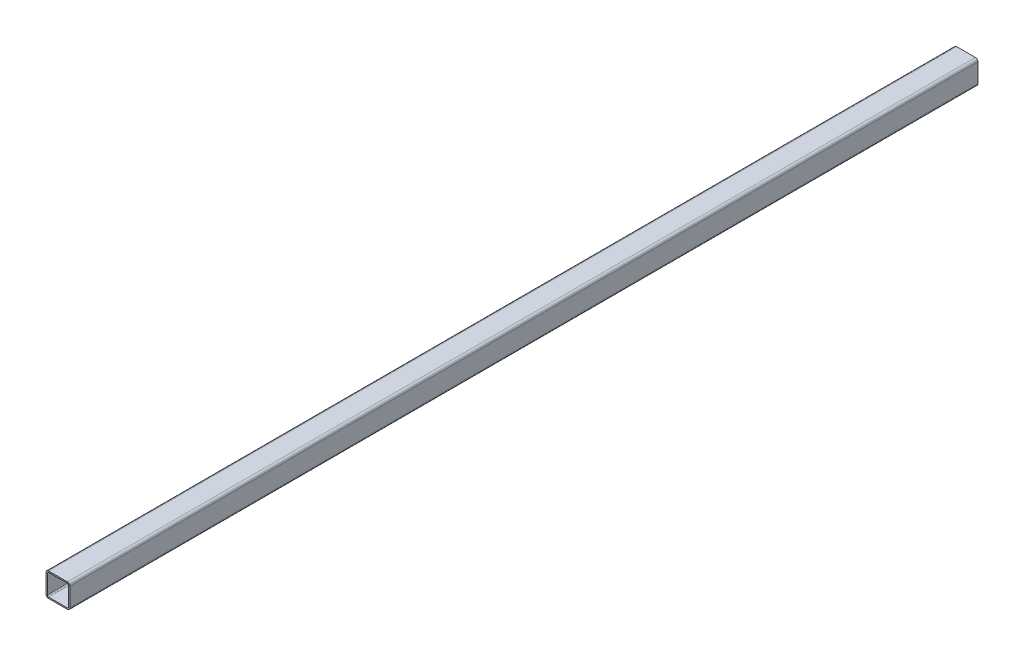
ISO-10303-21;
HEADER;
FILE_DESCRIPTION(('STEP AP214'),'2;1');
FILE_NAME('part.step','',(''),(''),'','','');
FILE_SCHEMA(('AUTOMOTIVE_DESIGN { 1 0 10303 214 1 1 1 1 }'));
ENDSEC;
DATA;
#1=APPLICATION_CONTEXT('core data for automotive mechanical design processes');
#2=APPLICATION_PROTOCOL_DEFINITION('international standard','automotive_design',2000,#1);
#3=PRODUCT_CONTEXT('',#1,'mechanical');
#4=PRODUCT('Part','Part','',(#3));
#5=PRODUCT_RELATED_PRODUCT_CATEGORY('part','',(#4));
#6=PRODUCT_DEFINITION_FORMATION('','',#4);
#7=PRODUCT_DEFINITION_CONTEXT('part definition',#1,'design');
#8=PRODUCT_DEFINITION('design','',#6,#7);
#9=PRODUCT_DEFINITION_SHAPE('','',#8);
#10=(LENGTH_UNIT() NAMED_UNIT(*) SI_UNIT(.MILLI.,.METRE.));
#11=(NAMED_UNIT(*) PLANE_ANGLE_UNIT() SI_UNIT($,.RADIAN.));
#12=(NAMED_UNIT(*) SI_UNIT($,.STERADIAN.) SOLID_ANGLE_UNIT());
#13=UNCERTAINTY_MEASURE_WITH_UNIT(LENGTH_MEASURE(1.E-05),#10,'distance_accuracy_value','');
#14=(GEOMETRIC_REPRESENTATION_CONTEXT(3) GLOBAL_UNCERTAINTY_ASSIGNED_CONTEXT((#13)) GLOBAL_UNIT_ASSIGNED_CONTEXT((#10,
#11,#12)) REPRESENTATION_CONTEXT('',''));
#15=CARTESIAN_POINT('',(0.,0.,0.));
#16=DIRECTION('',(0.,0.,1.));
#17=DIRECTION('',(1.,0.,0.));
#18=AXIS2_PLACEMENT_3D('',#15,#16,#17);
#19=CARTESIAN_POINT('',(660.,260.,-950.));
#20=DIRECTION('',(0.,-1.,0.));
#21=DIRECTION('',(0.,0.,-1.));
#22=AXIS2_PLACEMENT_3D('',#19,#20,#21);
#23=CYLINDRICAL_SURFACE('',#22,2.49999999999995);
#24=CARTESIAN_POINT('',(660.,270.,-950.));
#25=DIRECTION('',(0.,-1.,0.));
#26=DIRECTION('',(0.,0.,-1.));
#27=AXIS2_PLACEMENT_3D('',#24,#25,#26);
#28=CIRCLE('',#27,2.49999999999995);
#29=CARTESIAN_POINT('',(660.,270.,-952.5));
#30=VERTEX_POINT('',#29);
#31=EDGE_CURVE('E183',#30,#30,#28,.T.);
#32=ORIENTED_EDGE('',*,*,#31,.T.);
#33=EDGE_LOOP('',(#32));
#34=FACE_BOUND('',#33,.T.);
#35=CARTESIAN_POINT('',(660.,273.2,-950.));
#36=DIRECTION('',(0.,-1.,0.));
#37=DIRECTION('',(0.,0.,-1.));
#38=AXIS2_PLACEMENT_3D('',#35,#36,#37);
#39=CIRCLE('',#38,2.49999999999995);
#40=CARTESIAN_POINT('',(660.,273.2,-952.5));
#41=VERTEX_POINT('',#40);
#42=EDGE_CURVE('E20',#41,#41,#39,.T.);
#43=ORIENTED_EDGE('',*,*,#42,.F.);
#44=EDGE_LOOP('',(#43));
#45=FACE_BOUND('',#44,.T.);
#46=ADVANCED_FACE('F17',(#34,#45),#23,.F.);
#47=CARTESIAN_POINT('',(660.,260.,-910.));
#48=DIRECTION('',(0.,-1.,0.));
#49=DIRECTION('',(0.,0.,-1.));
#50=AXIS2_PLACEMENT_3D('',#47,#48,#49);
#51=CYLINDRICAL_SURFACE('',#50,2.49999999999995);
#52=CARTESIAN_POINT('',(660.,270.,-910.));
#53=DIRECTION('',(0.,-1.,0.));
#54=DIRECTION('',(0.,0.,-1.));
#55=AXIS2_PLACEMENT_3D('',#52,#53,#54);
#56=CIRCLE('',#55,2.49999999999995);
#57=CARTESIAN_POINT('',(660.,270.,-912.5));
#58=VERTEX_POINT('',#57);
#59=EDGE_CURVE('E253',#58,#58,#56,.T.);
#60=ORIENTED_EDGE('',*,*,#59,.T.);
#61=EDGE_LOOP('',(#60));
#62=FACE_BOUND('',#61,.T.);
#63=CARTESIAN_POINT('',(660.,273.2,-910.));
#64=DIRECTION('',(0.,-1.,0.));
#65=DIRECTION('',(0.,0.,-1.));
#66=AXIS2_PLACEMENT_3D('',#63,#64,#65);
#67=CIRCLE('',#66,2.49999999999995);
#68=CARTESIAN_POINT('',(660.,273.2,-912.5));
#69=VERTEX_POINT('',#68);
#70=EDGE_CURVE('E274',#69,#69,#67,.T.);
#71=ORIENTED_EDGE('',*,*,#70,.F.);
#72=EDGE_LOOP('',(#71));
#73=FACE_BOUND('',#72,.T.);
#74=ADVANCED_FACE('F284',(#62,#73),#51,.F.);
#75=CARTESIAN_POINT('',(680.,260.,-910.));
#76=DIRECTION('',(0.,-1.,0.));
#77=DIRECTION('',(0.,0.,-1.));
#78=AXIS2_PLACEMENT_3D('',#75,#76,#77);
#79=CYLINDRICAL_SURFACE('',#78,2.49999999999995);
#80=CARTESIAN_POINT('',(680.,270.,-910.));
#81=DIRECTION('',(0.,-1.,0.));
#82=DIRECTION('',(0.,0.,-1.));
#83=AXIS2_PLACEMENT_3D('',#80,#81,#82);
#84=CIRCLE('',#83,2.49999999999995);
#85=CARTESIAN_POINT('',(680.,270.,-912.5));
#86=VERTEX_POINT('',#85);
#87=EDGE_CURVE('E250',#86,#86,#84,.T.);
#88=ORIENTED_EDGE('',*,*,#87,.T.);
#89=EDGE_LOOP('',(#88));
#90=FACE_BOUND('',#89,.T.);
#91=CARTESIAN_POINT('',(680.,273.2,-910.));
#92=DIRECTION('',(0.,-1.,0.));
#93=DIRECTION('',(0.,0.,-1.));
#94=AXIS2_PLACEMENT_3D('',#91,#92,#93);
#95=CIRCLE('',#94,2.49999999999995);
#96=CARTESIAN_POINT('',(680.,273.2,-912.5));
#97=VERTEX_POINT('',#96);
#98=EDGE_CURVE('E272',#97,#97,#95,.T.);
#99=ORIENTED_EDGE('',*,*,#98,.F.);
#100=EDGE_LOOP('',(#99));
#101=FACE_BOUND('',#100,.T.);
#102=ADVANCED_FACE('F290',(#90,#101),#79,.F.);
#103=CARTESIAN_POINT('',(680.,260.,-950.));
#104=DIRECTION('',(0.,-1.,0.));
#105=DIRECTION('',(0.,0.,-1.));
#106=AXIS2_PLACEMENT_3D('',#103,#104,#105);
#107=CYLINDRICAL_SURFACE('',#106,2.49999999999995);
#108=CARTESIAN_POINT('',(680.,270.,-950.));
#109=DIRECTION('',(0.,-1.,0.));
#110=DIRECTION('',(0.,0.,-1.));
#111=AXIS2_PLACEMENT_3D('',#108,#109,#110);
#112=CIRCLE('',#111,2.49999999999995);
#113=CARTESIAN_POINT('',(680.,270.,-952.5));
#114=VERTEX_POINT('',#113);
#115=EDGE_CURVE('E247',#114,#114,#112,.T.);
#116=ORIENTED_EDGE('',*,*,#115,.T.);
#117=EDGE_LOOP('',(#116));
#118=FACE_BOUND('',#117,.T.);
#119=CARTESIAN_POINT('',(680.,273.2,-950.));
#120=DIRECTION('',(0.,-1.,0.));
#121=DIRECTION('',(0.,0.,-1.));
#122=AXIS2_PLACEMENT_3D('',#119,#120,#121);
#123=CIRCLE('',#122,2.49999999999995);
#124=CARTESIAN_POINT('',(680.,273.2,-952.5));
#125=VERTEX_POINT('',#124);
#126=EDGE_CURVE('E269',#125,#125,#123,.T.);
#127=ORIENTED_EDGE('',*,*,#126,.F.);
#128=EDGE_LOOP('',(#127));
#129=FACE_BOUND('',#128,.T.);
#130=ADVANCED_FACE('F375',(#118,#129),#107,.F.);
#131=CARTESIAN_POINT('',(680.,260.,950.));
#132=DIRECTION('',(0.,-1.,0.));
#133=DIRECTION('',(0.,0.,-1.));
#134=AXIS2_PLACEMENT_3D('',#131,#132,#133);
#135=CYLINDRICAL_SURFACE('',#134,2.49999999999995);
#136=CARTESIAN_POINT('',(680.,270.,950.));
#137=DIRECTION('',(0.,-1.,0.));
#138=DIRECTION('',(0.,0.,-1.));
#139=AXIS2_PLACEMENT_3D('',#136,#137,#138);
#140=CIRCLE('',#139,2.49999999999995);
#141=CARTESIAN_POINT('',(680.,270.,947.5));
#142=VERTEX_POINT('',#141);
#143=EDGE_CURVE('E244',#142,#142,#140,.T.);
#144=ORIENTED_EDGE('',*,*,#143,.T.);
#145=EDGE_LOOP('',(#144));
#146=FACE_BOUND('',#145,.T.);
#147=CARTESIAN_POINT('',(680.,273.2,950.));
#148=DIRECTION('',(0.,-1.,0.));
#149=DIRECTION('',(0.,0.,-1.));
#150=AXIS2_PLACEMENT_3D('',#147,#148,#149);
#151=CIRCLE('',#150,2.49999999999995);
#152=CARTESIAN_POINT('',(680.,273.2,947.5));
#153=VERTEX_POINT('',#152);
#154=EDGE_CURVE('E266',#153,#153,#151,.T.);
#155=ORIENTED_EDGE('',*,*,#154,.F.);
#156=EDGE_LOOP('',(#155));
#157=FACE_BOUND('',#156,.T.);
#158=ADVANCED_FACE('F371',(#146,#157),#135,.F.);
#159=CARTESIAN_POINT('',(680.,260.,910.));
#160=DIRECTION('',(0.,-1.,0.));
#161=DIRECTION('',(0.,0.,-1.));
#162=AXIS2_PLACEMENT_3D('',#159,#160,#161);
#163=CYLINDRICAL_SURFACE('',#162,2.49999999999995);
#164=CARTESIAN_POINT('',(680.,270.,910.));
#165=DIRECTION('',(0.,-1.,0.));
#166=DIRECTION('',(0.,0.,-1.));
#167=AXIS2_PLACEMENT_3D('',#164,#165,#166);
#168=CIRCLE('',#167,2.49999999999995);
#169=CARTESIAN_POINT('',(680.,270.,907.5));
#170=VERTEX_POINT('',#169);
#171=EDGE_CURVE('E241',#170,#170,#168,.T.);
#172=ORIENTED_EDGE('',*,*,#171,.T.);
#173=EDGE_LOOP('',(#172));
#174=FACE_BOUND('',#173,.T.);
#175=CARTESIAN_POINT('',(680.,273.2,910.));
#176=DIRECTION('',(0.,-1.,0.));
#177=DIRECTION('',(0.,0.,-1.));
#178=AXIS2_PLACEMENT_3D('',#175,#176,#177);
#179=CIRCLE('',#178,2.49999999999995);
#180=CARTESIAN_POINT('',(680.,273.2,907.5));
#181=VERTEX_POINT('',#180);
#182=EDGE_CURVE('E263',#181,#181,#179,.T.);
#183=ORIENTED_EDGE('',*,*,#182,.F.);
#184=EDGE_LOOP('',(#183));
#185=FACE_BOUND('',#184,.T.);
#186=ADVANCED_FACE('F367',(#174,#185),#163,.F.);
#187=CARTESIAN_POINT('',(660.,260.,910.));
#188=DIRECTION('',(0.,-1.,0.));
#189=DIRECTION('',(0.,0.,-1.));
#190=AXIS2_PLACEMENT_3D('',#187,#188,#189);
#191=CYLINDRICAL_SURFACE('',#190,2.49999999999995);
#192=CARTESIAN_POINT('',(660.,270.,910.));
#193=DIRECTION('',(0.,-1.,0.));
#194=DIRECTION('',(0.,0.,-1.));
#195=AXIS2_PLACEMENT_3D('',#192,#193,#194);
#196=CIRCLE('',#195,2.49999999999995);
#197=CARTESIAN_POINT('',(660.,270.,907.5));
#198=VERTEX_POINT('',#197);
#199=EDGE_CURVE('E238',#198,#198,#196,.T.);
#200=ORIENTED_EDGE('',*,*,#199,.T.);
#201=EDGE_LOOP('',(#200));
#202=FACE_BOUND('',#201,.T.);
#203=CARTESIAN_POINT('',(660.,273.2,910.));
#204=DIRECTION('',(0.,-1.,0.));
#205=DIRECTION('',(0.,0.,-1.));
#206=AXIS2_PLACEMENT_3D('',#203,#204,#205);
#207=CIRCLE('',#206,2.49999999999995);
#208=CARTESIAN_POINT('',(660.,273.2,907.5));
#209=VERTEX_POINT('',#208);
#210=EDGE_CURVE('E260',#209,#209,#207,.T.);
#211=ORIENTED_EDGE('',*,*,#210,.F.);
#212=EDGE_LOOP('',(#211));
#213=FACE_BOUND('',#212,.T.);
#214=ADVANCED_FACE('F363',(#202,#213),#191,.F.);
#215=CARTESIAN_POINT('',(660.,260.,950.));
#216=DIRECTION('',(0.,-1.,0.));
#217=DIRECTION('',(0.,0.,-1.));
#218=AXIS2_PLACEMENT_3D('',#215,#216,#217);
#219=CYLINDRICAL_SURFACE('',#218,2.49999999999995);
#220=CARTESIAN_POINT('',(660.,270.,950.));
#221=DIRECTION('',(0.,-1.,0.));
#222=DIRECTION('',(0.,0.,-1.));
#223=AXIS2_PLACEMENT_3D('',#220,#221,#222);
#224=CIRCLE('',#223,2.49999999999995);
#225=CARTESIAN_POINT('',(660.,270.,947.5));
#226=VERTEX_POINT('',#225);
#227=EDGE_CURVE('E179',#226,#226,#224,.T.);
#228=ORIENTED_EDGE('',*,*,#227,.T.);
#229=EDGE_LOOP('',(#228));
#230=FACE_BOUND('',#229,.T.);
#231=CARTESIAN_POINT('',(660.,273.2,950.));
#232=DIRECTION('',(0.,-1.,0.));
#233=DIRECTION('',(0.,0.,-1.));
#234=AXIS2_PLACEMENT_3D('',#231,#232,#233);
#235=CIRCLE('',#234,2.49999999999995);
#236=CARTESIAN_POINT('',(660.,273.2,947.5));
#237=VERTEX_POINT('',#236);
#238=EDGE_CURVE('E196',#237,#237,#235,.T.);
#239=ORIENTED_EDGE('',*,*,#238,.F.);
#240=EDGE_LOOP('',(#239));
#241=FACE_BOUND('',#240,.T.);
#242=ADVANCED_FACE('F359',(#230,#241),#219,.F.);
#243=CARTESIAN_POINT('',(646.4,276.4,1170.));
#244=DIRECTION('',(0.,0.,-1.));
#245=DIRECTION('',(-1.,0.,0.));
#246=AXIS2_PLACEMENT_3D('',#243,#244,#245);
#247=CYLINDRICAL_SURFACE('',#246,3.19999999999998);
#248=CARTESIAN_POINT('',(646.4,276.4,-1140.));
#249=DIRECTION('',(0.,0.,-1.));
#250=DIRECTION('',(-1.,0.,0.));
#251=AXIS2_PLACEMENT_3D('',#248,#249,#250);
#252=CIRCLE('',#251,3.19999999999998);
#253=CARTESIAN_POINT('',(643.2,276.4,-1140.));
#254=VERTEX_POINT('',#253);
#255=CARTESIAN_POINT('',(646.4,273.2,-1140.));
#256=VERTEX_POINT('',#255);
#257=EDGE_CURVE('E218',#254,#256,#252,.F.);
#258=ORIENTED_EDGE('',*,*,#257,.F.);
#259=DIRECTION('',(0.,0.,1.));
#260=VECTOR('',#259,1.);
#261=CARTESIAN_POINT('',(643.2,276.4,1170.));
#262=LINE('',#261,#260);
#263=CARTESIAN_POINT('',(643.2,276.4,1140.));
#264=VERTEX_POINT('',#263);
#265=EDGE_CURVE('E184',#264,#254,#262,.F.);
#266=ORIENTED_EDGE('',*,*,#265,.F.);
#267=CARTESIAN_POINT('',(646.4,276.4,1140.));
#268=DIRECTION('',(0.,0.,-1.));
#269=DIRECTION('',(-1.,0.,0.));
#270=AXIS2_PLACEMENT_3D('',#267,#268,#269);
#271=CIRCLE('',#270,3.19999999999998);
#272=CARTESIAN_POINT('',(646.4,273.2,1140.));
#273=VERTEX_POINT('',#272);
#274=EDGE_CURVE('E234',#273,#264,#271,.T.);
#275=ORIENTED_EDGE('',*,*,#274,.F.);
#276=DIRECTION('',(0.,0.,1.));
#277=VECTOR('',#276,1.);
#278=CARTESIAN_POINT('',(646.4,273.2,1170.));
#279=LINE('',#278,#277);
#280=EDGE_CURVE('E194',#256,#273,#279,.T.);
#281=ORIENTED_EDGE('',*,*,#280,.F.);
#282=EDGE_LOOP('',(#258,#266,#275,#281));
#283=FACE_BOUND('',#282,.T.);
#284=ADVANCED_FACE('F355',(#283),#247,.F.);
#285=CARTESIAN_POINT('',(646.4,273.2,1170.));
#286=DIRECTION('',(0.,1.,0.));
#287=DIRECTION('',(-1.,0.,0.));
#288=AXIS2_PLACEMENT_3D('',#285,#286,#287);
#289=PLANE('',#288);
#290=ORIENTED_EDGE('',*,*,#280,.T.);
#291=DIRECTION('',(1.,0.,0.));
#292=VECTOR('',#291,1.);
#293=CARTESIAN_POINT('',(693.6,273.2,1140.));
#294=LINE('',#293,#292);
#295=CARTESIAN_POINT('',(693.6,273.2,1140.));
#296=VERTEX_POINT('',#295);
#297=EDGE_CURVE('E158',#296,#273,#294,.F.);
#298=ORIENTED_EDGE('',*,*,#297,.F.);
#299=DIRECTION('',(0.,0.,-1.));
#300=VECTOR('',#299,1.);
#301=CARTESIAN_POINT('',(693.6,273.2,1170.));
#302=LINE('',#301,#300);
#303=CARTESIAN_POINT('',(693.6,273.2,-1140.));
#304=VERTEX_POINT('',#303);
#305=EDGE_CURVE('E191',#296,#304,#302,.T.);
#306=ORIENTED_EDGE('',*,*,#305,.T.);
#307=DIRECTION('',(-1.,0.,0.));
#308=VECTOR('',#307,1.);
#309=CARTESIAN_POINT('',(646.4,273.2,-1140.));
#310=LINE('',#309,#308);
#311=EDGE_CURVE('E217',#256,#304,#310,.F.);
#312=ORIENTED_EDGE('',*,*,#311,.F.);
#313=EDGE_LOOP('',(#290,#298,#306,#312));
#314=FACE_BOUND('',#313,.T.);
#315=ORIENTED_EDGE('',*,*,#238,.T.);
#316=EDGE_LOOP('',(#315));
#317=FACE_BOUND('',#316,.T.);
#318=ORIENTED_EDGE('',*,*,#210,.T.);
#319=EDGE_LOOP('',(#318));
#320=FACE_BOUND('',#319,.T.);
#321=ORIENTED_EDGE('',*,*,#182,.T.);
#322=EDGE_LOOP('',(#321));
#323=FACE_BOUND('',#322,.T.);
#324=ORIENTED_EDGE('',*,*,#154,.T.);
#325=EDGE_LOOP('',(#324));
#326=FACE_BOUND('',#325,.T.);
#327=ORIENTED_EDGE('',*,*,#126,.T.);
#328=EDGE_LOOP('',(#327));
#329=FACE_BOUND('',#328,.T.);
#330=ORIENTED_EDGE('',*,*,#98,.T.);
#331=EDGE_LOOP('',(#330));
#332=FACE_BOUND('',#331,.T.);
#333=ORIENTED_EDGE('',*,*,#70,.T.);
#334=EDGE_LOOP('',(#333));
#335=FACE_BOUND('',#334,.T.);
#336=ORIENTED_EDGE('',*,*,#42,.T.);
#337=EDGE_LOOP('',(#336));
#338=FACE_BOUND('',#337,.T.);
#339=ADVANCED_FACE('F281',(#314,#317,#320,#323,#326,#329,#332,#335,#338),#289,.T.);
#340=CARTESIAN_POINT('',(693.6,276.4,1170.));
#341=DIRECTION('',(0.,0.,-1.));
#342=DIRECTION('',(-1.,0.,0.));
#343=AXIS2_PLACEMENT_3D('',#340,#341,#342);
#344=CYLINDRICAL_SURFACE('',#343,3.19999999999998);
#345=CARTESIAN_POINT('',(693.6,276.4,-1140.));
#346=DIRECTION('',(0.,0.,-1.));
#347=DIRECTION('',(-1.,0.,0.));
#348=AXIS2_PLACEMENT_3D('',#345,#346,#347);
#349=CIRCLE('',#348,3.19999999999998);
#350=CARTESIAN_POINT('',(696.8,276.4,-1140.));
#351=VERTEX_POINT('',#350);
#352=EDGE_CURVE('E215',#304,#351,#349,.F.);
#353=ORIENTED_EDGE('',*,*,#352,.F.);
#354=ORIENTED_EDGE('',*,*,#305,.F.);
#355=CARTESIAN_POINT('',(693.6,276.4,1140.));
#356=DIRECTION('',(0.,0.,-1.));
#357=DIRECTION('',(-1.,0.,0.));
#358=AXIS2_PLACEMENT_3D('',#355,#356,#357);
#359=CIRCLE('',#358,3.19999999999998);
#360=CARTESIAN_POINT('',(696.8,276.4,1140.));
#361=VERTEX_POINT('',#360);
#362=EDGE_CURVE('E156',#361,#296,#359,.T.);
#363=ORIENTED_EDGE('',*,*,#362,.F.);
#364=DIRECTION('',(0.,0.,1.));
#365=VECTOR('',#364,1.);
#366=CARTESIAN_POINT('',(696.8,276.4,1170.));
#367=LINE('',#366,#365);
#368=EDGE_CURVE('E142',#351,#361,#367,.T.);
#369=ORIENTED_EDGE('',*,*,#368,.F.);
#370=EDGE_LOOP('',(#353,#354,#363,#369));
#371=FACE_BOUND('',#370,.T.);
#372=ADVANCED_FACE('F349',(#371),#344,.F.);
#373=CARTESIAN_POINT('',(696.8,323.6,1170.));
#374=DIRECTION('',(-1.,0.,0.));
#375=DIRECTION('',(0.,0.,1.));
#376=AXIS2_PLACEMENT_3D('',#373,#374,#375);
#377=PLANE('',#376);
#378=ORIENTED_EDGE('',*,*,#368,.T.);
#379=DIRECTION('',(0.,1.,0.));
#380=VECTOR('',#379,1.);
#381=CARTESIAN_POINT('',(696.8,300.,1140.));
#382=LINE('',#381,#380);
#383=CARTESIAN_POINT('',(696.8,323.6,1140.));
#384=VERTEX_POINT('',#383);
#385=EDGE_CURVE('E149',#384,#361,#382,.F.);
#386=ORIENTED_EDGE('',*,*,#385,.F.);
#387=DIRECTION('',(0.,0.,-1.));
#388=VECTOR('',#387,1.);
#389=CARTESIAN_POINT('',(696.8,323.6,1170.));
#390=LINE('',#389,#388);
#391=CARTESIAN_POINT('',(696.8,323.6,-1140.));
#392=VERTEX_POINT('',#391);
#393=EDGE_CURVE('E134',#384,#392,#390,.T.);
#394=ORIENTED_EDGE('',*,*,#393,.T.);
#395=DIRECTION('',(0.,1.,0.));
#396=VECTOR('',#395,1.);
#397=CARTESIAN_POINT('',(696.8,300.,-1140.));
#398=LINE('',#397,#396);
#399=EDGE_CURVE('E214',#351,#392,#398,.T.);
#400=ORIENTED_EDGE('',*,*,#399,.F.);
#401=EDGE_LOOP('',(#378,#386,#394,#400));
#402=FACE_BOUND('',#401,.T.);
#403=ADVANCED_FACE('F154',(#402),#377,.T.);
#404=CARTESIAN_POINT('',(693.6,323.6,1170.));
#405=DIRECTION('',(0.,0.,-1.));
#406=DIRECTION('',(-1.,0.,0.));
#407=AXIS2_PLACEMENT_3D('',#404,#405,#406);
#408=CYLINDRICAL_SURFACE('',#407,3.19999999999998);
#409=CARTESIAN_POINT('',(693.6,323.6,-1140.));
#410=DIRECTION('',(0.,0.,-1.));
#411=DIRECTION('',(-1.,0.,0.));
#412=AXIS2_PLACEMENT_3D('',#409,#410,#411);
#413=CIRCLE('',#412,3.19999999999998);
#414=CARTESIAN_POINT('',(693.6,326.8,-1140.));
#415=VERTEX_POINT('',#414);
#416=EDGE_CURVE('E138',#392,#415,#413,.F.);
#417=ORIENTED_EDGE('',*,*,#416,.F.);
#418=ORIENTED_EDGE('',*,*,#393,.F.);
#419=CARTESIAN_POINT('',(693.6,323.6,1140.));
#420=DIRECTION('',(0.,0.,-1.));
#421=DIRECTION('',(-1.,0.,0.));
#422=AXIS2_PLACEMENT_3D('',#419,#420,#421);
#423=CIRCLE('',#422,3.19999999999998);
#424=CARTESIAN_POINT('',(693.6,326.8,1140.));
#425=VERTEX_POINT('',#424);
#426=EDGE_CURVE('E137',#425,#384,#423,.T.);
#427=ORIENTED_EDGE('',*,*,#426,.F.);
#428=DIRECTION('',(0.,0.,1.));
#429=VECTOR('',#428,1.);
#430=CARTESIAN_POINT('',(693.6,326.8,1170.));
#431=LINE('',#430,#429);
#432=EDGE_CURVE('E127',#415,#425,#431,.T.);
#433=ORIENTED_EDGE('',*,*,#432,.F.);
#434=EDGE_LOOP('',(#417,#418,#427,#433));
#435=FACE_BOUND('',#434,.T.);
#436=ADVANCED_FACE('F136',(#435),#408,.F.);
#437=CARTESIAN_POINT('',(693.6,326.8,1170.));
#438=DIRECTION('',(0.,-1.,0.));
#439=DIRECTION('',(1.,0.,0.));
#440=AXIS2_PLACEMENT_3D('',#437,#438,#439);
#441=PLANE('',#440);
#442=ORIENTED_EDGE('',*,*,#432,.T.);
#443=DIRECTION('',(1.,0.,0.));
#444=VECTOR('',#443,1.);
#445=CARTESIAN_POINT('',(693.6,326.8,1140.));
#446=LINE('',#445,#444);
#447=CARTESIAN_POINT('',(646.4,326.8,1140.));
#448=VERTEX_POINT('',#447);
#449=EDGE_CURVE('E152',#448,#425,#446,.T.);
#450=ORIENTED_EDGE('',*,*,#449,.F.);
#451=DIRECTION('',(0.,0.,-1.));
#452=VECTOR('',#451,1.);
#453=CARTESIAN_POINT('',(646.4,326.8,1170.));
#454=LINE('',#453,#452);
#455=CARTESIAN_POINT('',(646.4,326.8,-1140.));
#456=VERTEX_POINT('',#455);
#457=EDGE_CURVE('E186',#448,#456,#454,.T.);
#458=ORIENTED_EDGE('',*,*,#457,.T.);
#459=DIRECTION('',(-1.,0.,0.));
#460=VECTOR('',#459,1.);
#461=CARTESIAN_POINT('',(646.4,326.8,-1140.));
#462=LINE('',#461,#460);
#463=EDGE_CURVE('E212',#415,#456,#462,.T.);
#464=ORIENTED_EDGE('',*,*,#463,.F.);
#465=EDGE_LOOP('',(#442,#450,#458,#464));
#466=FACE_BOUND('',#465,.T.);
#467=ADVANCED_FACE('F341',(#466),#441,.T.);
#468=CARTESIAN_POINT('',(646.4,323.6,1170.));
#469=DIRECTION('',(0.,0.,-1.));
#470=DIRECTION('',(-1.,0.,0.));
#471=AXIS2_PLACEMENT_3D('',#468,#469,#470);
#472=CYLINDRICAL_SURFACE('',#471,3.19999999999998);
#473=CARTESIAN_POINT('',(646.4,323.6,-1140.));
#474=DIRECTION('',(0.,0.,-1.));
#475=DIRECTION('',(-1.,0.,0.));
#476=AXIS2_PLACEMENT_3D('',#473,#474,#475);
#477=CIRCLE('',#476,3.19999999999998);
#478=CARTESIAN_POINT('',(643.2,323.6,-1140.));
#479=VERTEX_POINT('',#478);
#480=EDGE_CURVE('E210',#456,#479,#477,.F.);
#481=ORIENTED_EDGE('',*,*,#480,.F.);
#482=ORIENTED_EDGE('',*,*,#457,.F.);
#483=CARTESIAN_POINT('',(646.4,323.6,1140.));
#484=DIRECTION('',(0.,0.,-1.));
#485=DIRECTION('',(-1.,0.,0.));
#486=AXIS2_PLACEMENT_3D('',#483,#484,#485);
#487=CIRCLE('',#486,3.19999999999998);
#488=CARTESIAN_POINT('',(643.2,323.6,1140.));
#489=VERTEX_POINT('',#488);
#490=EDGE_CURVE('E231',#489,#448,#487,.T.);
#491=ORIENTED_EDGE('',*,*,#490,.F.);
#492=DIRECTION('',(0.,0.,1.));
#493=VECTOR('',#492,1.);
#494=CARTESIAN_POINT('',(643.2,323.6,1170.));
#495=LINE('',#494,#493);
#496=EDGE_CURVE('E181',#479,#489,#495,.T.);
#497=ORIENTED_EDGE('',*,*,#496,.F.);
#498=EDGE_LOOP('',(#481,#482,#491,#497));
#499=FACE_BOUND('',#498,.T.);
#500=ADVANCED_FACE('F337',(#499),#472,.F.);
#501=CARTESIAN_POINT('',(643.2,276.4,1170.));
#502=DIRECTION('',(1.,0.,0.));
#503=DIRECTION('',(0.,1.,0.));
#504=AXIS2_PLACEMENT_3D('',#501,#502,#503);
#505=PLANE('',#504);
#506=ORIENTED_EDGE('',*,*,#496,.T.);
#507=DIRECTION('',(0.,1.,0.));
#508=VECTOR('',#507,1.);
#509=CARTESIAN_POINT('',(643.2,300.,1140.));
#510=LINE('',#509,#508);
#511=EDGE_CURVE('E233',#264,#489,#510,.T.);
#512=ORIENTED_EDGE('',*,*,#511,.F.);
#513=ORIENTED_EDGE('',*,*,#265,.T.);
#514=DIRECTION('',(0.,1.,0.));
#515=VECTOR('',#514,1.);
#516=CARTESIAN_POINT('',(643.2,300.,-1140.));
#517=LINE('',#516,#515);
#518=EDGE_CURVE('E209',#479,#254,#517,.F.);
#519=ORIENTED_EDGE('',*,*,#518,.F.);
#520=EDGE_LOOP('',(#506,#512,#513,#519));
#521=FACE_BOUND('',#520,.T.);
#522=ADVANCED_FACE('F333',(#521),#505,.T.);
#523=CARTESIAN_POINT('',(646.4,270.,1170.));
#524=DIRECTION('',(0.,1.,0.));
#525=DIRECTION('',(-1.,0.,0.));
#526=AXIS2_PLACEMENT_3D('',#523,#524,#525);
#527=PLANE('',#526);
#528=DIRECTION('',(0.,0.,-1.));
#529=VECTOR('',#528,1.);
#530=CARTESIAN_POINT('',(693.6,270.,1170.));
#531=LINE('',#530,#529);
#532=CARTESIAN_POINT('',(693.6,270.,1140.));
#533=VERTEX_POINT('',#532);
#534=CARTESIAN_POINT('',(693.6,270.,-1140.));
#535=VERTEX_POINT('',#534);
#536=EDGE_CURVE('E164',#533,#535,#531,.T.);
#537=ORIENTED_EDGE('',*,*,#536,.F.);
#538=DIRECTION('',(1.,0.,0.));
#539=VECTOR('',#538,1.);
#540=CARTESIAN_POINT('',(693.6,270.,1140.));
#541=LINE('',#540,#539);
#542=CARTESIAN_POINT('',(646.4,270.,1140.));
#543=VERTEX_POINT('',#542);
#544=EDGE_CURVE('E222',#543,#533,#541,.T.);
#545=ORIENTED_EDGE('',*,*,#544,.F.);
#546=DIRECTION('',(0.,0.,-1.));
#547=VECTOR('',#546,1.);
#548=CARTESIAN_POINT('',(646.4,270.,1170.));
#549=LINE('',#548,#547);
#550=CARTESIAN_POINT('',(646.4,270.,-1140.));
#551=VERTEX_POINT('',#550);
#552=EDGE_CURVE('E177',#551,#543,#549,.F.);
#553=ORIENTED_EDGE('',*,*,#552,.F.);
#554=DIRECTION('',(-1.,0.,0.));
#555=VECTOR('',#554,1.);
#556=CARTESIAN_POINT('',(646.4,270.,-1140.));
#557=LINE('',#556,#555);
#558=EDGE_CURVE('E205',#535,#551,#557,.T.);
#559=ORIENTED_EDGE('',*,*,#558,.F.);
#560=EDGE_LOOP('',(#537,#545,#553,#559));
#561=FACE_BOUND('',#560,.T.);
#562=ORIENTED_EDGE('',*,*,#227,.F.);
#563=EDGE_LOOP('',(#562));
#564=FACE_BOUND('',#563,.T.);
#565=ORIENTED_EDGE('',*,*,#199,.F.);
#566=EDGE_LOOP('',(#565));
#567=FACE_BOUND('',#566,.T.);
#568=ORIENTED_EDGE('',*,*,#171,.F.);
#569=EDGE_LOOP('',(#568));
#570=FACE_BOUND('',#569,.T.);
#571=ORIENTED_EDGE('',*,*,#143,.F.);
#572=EDGE_LOOP('',(#571));
#573=FACE_BOUND('',#572,.T.);
#574=ORIENTED_EDGE('',*,*,#115,.F.);
#575=EDGE_LOOP('',(#574));
#576=FACE_BOUND('',#575,.T.);
#577=ORIENTED_EDGE('',*,*,#87,.F.);
#578=EDGE_LOOP('',(#577));
#579=FACE_BOUND('',#578,.T.);
#580=ORIENTED_EDGE('',*,*,#59,.F.);
#581=EDGE_LOOP('',(#580));
#582=FACE_BOUND('',#581,.T.);
#583=ORIENTED_EDGE('',*,*,#31,.F.);
#584=EDGE_LOOP('',(#583));
#585=FACE_BOUND('',#584,.T.);
#586=ADVANCED_FACE('F329',(#561,#564,#567,#570,#573,#576,#579,#582,#585),#527,.F.);
#587=CARTESIAN_POINT('',(646.4,276.4,1170.));
#588=DIRECTION('',(0.,0.,-1.));
#589=DIRECTION('',(-1.,0.,0.));
#590=AXIS2_PLACEMENT_3D('',#587,#588,#589);
#591=CYLINDRICAL_SURFACE('',#590,6.40000000000007);
#592=CARTESIAN_POINT('',(646.4,276.4,1140.));
#593=DIRECTION('',(0.,0.,-1.));
#594=DIRECTION('',(-1.,0.,0.));
#595=AXIS2_PLACEMENT_3D('',#592,#593,#594);
#596=CIRCLE('',#595,6.40000000000007);
#597=CARTESIAN_POINT('',(640.,276.4,1140.));
#598=VERTEX_POINT('',#597);
#599=EDGE_CURVE('E223',#598,#543,#596,.F.);
#600=ORIENTED_EDGE('',*,*,#599,.F.);
#601=DIRECTION('',(0.,0.,-1.));
#602=VECTOR('',#601,1.);
#603=CARTESIAN_POINT('',(640.,276.4,1170.));
#604=LINE('',#603,#602);
#605=CARTESIAN_POINT('',(640.,276.4,-1140.));
#606=VERTEX_POINT('',#605);
#607=EDGE_CURVE('E174',#598,#606,#604,.T.);
#608=ORIENTED_EDGE('',*,*,#607,.T.);
#609=CARTESIAN_POINT('',(646.4,276.4,-1140.));
#610=DIRECTION('',(0.,0.,-1.));
#611=DIRECTION('',(-1.,0.,0.));
#612=AXIS2_PLACEMENT_3D('',#609,#610,#611);
#613=CIRCLE('',#612,6.40000000000007);
#614=EDGE_CURVE('E203',#551,#606,#613,.T.);
#615=ORIENTED_EDGE('',*,*,#614,.F.);
#616=ORIENTED_EDGE('',*,*,#552,.T.);
#617=EDGE_LOOP('',(#600,#608,#615,#616));
#618=FACE_BOUND('',#617,.T.);
#619=ADVANCED_FACE('F325',(#618),#591,.T.);
#620=CARTESIAN_POINT('',(640.,276.4,1170.));
#621=DIRECTION('',(1.,0.,0.));
#622=DIRECTION('',(0.,0.,-1.));
#623=AXIS2_PLACEMENT_3D('',#620,#621,#622);
#624=PLANE('',#623);
#625=ORIENTED_EDGE('',*,*,#607,.F.);
#626=DIRECTION('',(0.,1.,0.));
#627=VECTOR('',#626,1.);
#628=CARTESIAN_POINT('',(640.,300.,1140.));
#629=LINE('',#628,#627);
#630=CARTESIAN_POINT('',(640.,323.6,1140.));
#631=VERTEX_POINT('',#630);
#632=EDGE_CURVE('E226',#631,#598,#629,.F.);
#633=ORIENTED_EDGE('',*,*,#632,.F.);
#634=DIRECTION('',(0.,0.,-1.));
#635=VECTOR('',#634,1.);
#636=CARTESIAN_POINT('',(640.,323.6,1170.));
#637=LINE('',#636,#635);
#638=CARTESIAN_POINT('',(640.,323.6,-1140.));
#639=VERTEX_POINT('',#638);
#640=EDGE_CURVE('E172',#639,#631,#637,.F.);
#641=ORIENTED_EDGE('',*,*,#640,.F.);
#642=DIRECTION('',(0.,1.,0.));
#643=VECTOR('',#642,1.);
#644=CARTESIAN_POINT('',(640.,300.,-1140.));
#645=LINE('',#644,#643);
#646=EDGE_CURVE('E202',#606,#639,#645,.T.);
#647=ORIENTED_EDGE('',*,*,#646,.F.);
#648=EDGE_LOOP('',(#625,#633,#641,#647));
#649=FACE_BOUND('',#648,.T.);
#650=ADVANCED_FACE('F321',(#649),#624,.F.);
#651=CARTESIAN_POINT('',(646.4,323.6,1170.));
#652=DIRECTION('',(0.,0.,-1.));
#653=DIRECTION('',(-1.,0.,0.));
#654=AXIS2_PLACEMENT_3D('',#651,#652,#653);
#655=CYLINDRICAL_SURFACE('',#654,6.40000000000007);
#656=CARTESIAN_POINT('',(646.4,323.6,1140.));
#657=DIRECTION('',(0.,0.,-1.));
#658=DIRECTION('',(-1.,0.,0.));
#659=AXIS2_PLACEMENT_3D('',#656,#657,#658);
#660=CIRCLE('',#659,6.40000000000007);
#661=CARTESIAN_POINT('',(646.4,330.,1140.));
#662=VERTEX_POINT('',#661);
#663=EDGE_CURVE('E227',#662,#631,#660,.F.);
#664=ORIENTED_EDGE('',*,*,#663,.F.);
#665=DIRECTION('',(0.,0.,1.));
#666=VECTOR('',#665,1.);
#667=CARTESIAN_POINT('',(646.4,330.,1170.));
#668=LINE('',#667,#666);
#669=CARTESIAN_POINT('',(646.4,330.,-1140.));
#670=VERTEX_POINT('',#669);
#671=EDGE_CURVE('E169',#662,#670,#668,.F.);
#672=ORIENTED_EDGE('',*,*,#671,.T.);
#673=CARTESIAN_POINT('',(646.4,323.6,-1140.));
#674=DIRECTION('',(0.,0.,-1.));
#675=DIRECTION('',(-1.,0.,0.));
#676=AXIS2_PLACEMENT_3D('',#673,#674,#675);
#677=CIRCLE('',#676,6.40000000000007);
#678=EDGE_CURVE('E200',#639,#670,#677,.T.);
#679=ORIENTED_EDGE('',*,*,#678,.F.);
#680=ORIENTED_EDGE('',*,*,#640,.T.);
#681=EDGE_LOOP('',(#664,#672,#679,#680));
#682=FACE_BOUND('',#681,.T.);
#683=ADVANCED_FACE('F317',(#682),#655,.T.);
#684=CARTESIAN_POINT('',(693.6,330.,1170.));
#685=DIRECTION('',(0.,-1.,0.));
#686=DIRECTION('',(1.,0.,0.));
#687=AXIS2_PLACEMENT_3D('',#684,#685,#686);
#688=PLANE('',#687);
#689=ORIENTED_EDGE('',*,*,#671,.F.);
#690=DIRECTION('',(1.,0.,0.));
#691=VECTOR('',#690,1.);
#692=CARTESIAN_POINT('',(693.6,330.,1140.));
#693=LINE('',#692,#691);
#694=CARTESIAN_POINT('',(693.6,330.,1140.));
#695=VERTEX_POINT('',#694);
#696=EDGE_CURVE('E230',#695,#662,#693,.F.);
#697=ORIENTED_EDGE('',*,*,#696,.F.);
#698=DIRECTION('',(0.,0.,-1.));
#699=VECTOR('',#698,1.);
#700=CARTESIAN_POINT('',(693.6,330.,1170.));
#701=LINE('',#700,#699);
#702=CARTESIAN_POINT('',(693.6,330.,-1140.));
#703=VERTEX_POINT('',#702);
#704=EDGE_CURVE('E165',#703,#695,#701,.F.);
#705=ORIENTED_EDGE('',*,*,#704,.F.);
#706=DIRECTION('',(-1.,0.,0.));
#707=VECTOR('',#706,1.);
#708=CARTESIAN_POINT('',(646.4,330.,-1140.));
#709=LINE('',#708,#707);
#710=EDGE_CURVE('E199',#670,#703,#709,.F.);
#711=ORIENTED_EDGE('',*,*,#710,.F.);
#712=EDGE_LOOP('',(#689,#697,#705,#711));
#713=FACE_BOUND('',#712,.T.);
#714=ADVANCED_FACE('F313',(#713),#688,.F.);
#715=CARTESIAN_POINT('',(693.6,276.4,1170.));
#716=DIRECTION('',(0.,0.,-1.));
#717=DIRECTION('',(-1.,0.,0.));
#718=AXIS2_PLACEMENT_3D('',#715,#716,#717);
#719=CYLINDRICAL_SURFACE('',#718,6.40000000000007);
#720=CARTESIAN_POINT('',(693.6,276.4,1140.));
#721=DIRECTION('',(0.,0.,-1.));
#722=DIRECTION('',(-1.,0.,0.));
#723=AXIS2_PLACEMENT_3D('',#720,#721,#722);
#724=CIRCLE('',#723,6.40000000000007);
#725=CARTESIAN_POINT('',(700.,276.4,1140.));
#726=VERTEX_POINT('',#725);
#727=EDGE_CURVE('E168',#533,#726,#724,.F.);
#728=ORIENTED_EDGE('',*,*,#727,.F.);
#729=ORIENTED_EDGE('',*,*,#536,.T.);
#730=CARTESIAN_POINT('',(693.6,276.4,-1140.));
#731=DIRECTION('',(0.,0.,-1.));
#732=DIRECTION('',(-1.,0.,0.));
#733=AXIS2_PLACEMENT_3D('',#730,#731,#732);
#734=CIRCLE('',#733,6.40000000000007);
#735=CARTESIAN_POINT('',(700.,276.4,-1140.));
#736=VERTEX_POINT('',#735);
#737=EDGE_CURVE('E206',#736,#535,#734,.T.);
#738=ORIENTED_EDGE('',*,*,#737,.F.);
#739=DIRECTION('',(0.,0.,1.));
#740=VECTOR('',#739,1.);
#741=CARTESIAN_POINT('',(700.,276.4,1170.));
#742=LINE('',#741,#740);
#743=EDGE_CURVE('E198',#736,#726,#742,.T.);
#744=ORIENTED_EDGE('',*,*,#743,.T.);
#745=EDGE_LOOP('',(#728,#729,#738,#744));
#746=FACE_BOUND('',#745,.T.);
#747=ADVANCED_FACE('F309',(#746),#719,.T.);
#748=CARTESIAN_POINT('',(693.6,300.,1140.));
#749=DIRECTION('',(0.,0.,1.));
#750=DIRECTION('',(1.,0.,0.));
#751=AXIS2_PLACEMENT_3D('',#748,#749,#750);
#752=PLANE('',#751);
#753=ORIENTED_EDGE('',*,*,#727,.T.);
#754=DIRECTION('',(0.,1.,0.));
#755=VECTOR('',#754,1.);
#756=CARTESIAN_POINT('',(700.,323.6,1140.));
#757=LINE('',#756,#755);
#758=CARTESIAN_POINT('',(700.,323.6,1140.));
#759=VERTEX_POINT('',#758);
#760=EDGE_CURVE('E595',#726,#759,#757,.T.);
#761=ORIENTED_EDGE('',*,*,#760,.T.);
#762=CARTESIAN_POINT('',(693.6,323.6,1140.));
#763=DIRECTION('',(0.,0.,-1.));
#764=DIRECTION('',(-1.,0.,0.));
#765=AXIS2_PLACEMENT_3D('',#762,#763,#764);
#766=CIRCLE('',#765,6.40000000000007);
#767=EDGE_CURVE('E167',#695,#759,#766,.T.);
#768=ORIENTED_EDGE('',*,*,#767,.F.);
#769=ORIENTED_EDGE('',*,*,#696,.T.);
#770=ORIENTED_EDGE('',*,*,#663,.T.);
#771=ORIENTED_EDGE('',*,*,#632,.T.);
#772=ORIENTED_EDGE('',*,*,#599,.T.);
#773=ORIENTED_EDGE('',*,*,#544,.T.);
#774=EDGE_LOOP('',(#753,#761,#768,#769,#770,#771,#772,#773));
#775=FACE_BOUND('',#774,.T.);
#776=ORIENTED_EDGE('',*,*,#511,.T.);
#777=ORIENTED_EDGE('',*,*,#490,.T.);
#778=ORIENTED_EDGE('',*,*,#449,.T.);
#779=ORIENTED_EDGE('',*,*,#426,.T.);
#780=ORIENTED_EDGE('',*,*,#385,.T.);
#781=ORIENTED_EDGE('',*,*,#362,.T.);
#782=ORIENTED_EDGE('',*,*,#297,.T.);
#783=ORIENTED_EDGE('',*,*,#274,.T.);
#784=EDGE_LOOP('',(#776,#777,#778,#779,#780,#781,#782,#783));
#785=FACE_BOUND('',#784,.T.);
#786=ADVANCED_FACE('F147',(#775,#785),#752,.T.);
#787=CARTESIAN_POINT('',(693.6,323.6,1170.));
#788=DIRECTION('',(0.,0.,-1.));
#789=DIRECTION('',(-1.,0.,0.));
#790=AXIS2_PLACEMENT_3D('',#787,#788,#789);
#791=CYLINDRICAL_SURFACE('',#790,6.40000000000007);
#792=ORIENTED_EDGE('',*,*,#767,.T.);
#793=DIRECTION('',(0.,0.,1.));
#794=VECTOR('',#793,1.);
#795=CARTESIAN_POINT('',(700.,323.6,1170.));
#796=LINE('',#795,#794);
#797=CARTESIAN_POINT('',(700.,323.6,-1140.));
#798=VERTEX_POINT('',#797);
#799=EDGE_CURVE('E26',#759,#798,#796,.F.);
#800=ORIENTED_EDGE('',*,*,#799,.T.);
#801=CARTESIAN_POINT('',(693.6,323.6,-1140.));
#802=DIRECTION('',(0.,0.,-1.));
#803=DIRECTION('',(-1.,0.,0.));
#804=AXIS2_PLACEMENT_3D('',#801,#802,#803);
#805=CIRCLE('',#804,6.40000000000007);
#806=EDGE_CURVE('E34',#703,#798,#805,.T.);
#807=ORIENTED_EDGE('',*,*,#806,.F.);
#808=ORIENTED_EDGE('',*,*,#704,.T.);
#809=EDGE_LOOP('',(#792,#800,#807,#808));
#810=FACE_BOUND('',#809,.T.);
#811=ADVANCED_FACE('F300',(#810),#791,.T.);
#812=CARTESIAN_POINT('',(646.4,300.,-1140.));
#813=DIRECTION('',(0.,0.,-1.));
#814=DIRECTION('',(-1.,0.,0.));
#815=AXIS2_PLACEMENT_3D('',#812,#813,#814);
#816=PLANE('',#815);
#817=ORIENTED_EDGE('',*,*,#806,.T.);
#818=DIRECTION('',(0.,1.,0.));
#819=VECTOR('',#818,1.);
#820=CARTESIAN_POINT('',(700.,323.6,-1140.));
#821=LINE('',#820,#819);
#822=EDGE_CURVE('E11',#798,#736,#821,.F.);
#823=ORIENTED_EDGE('',*,*,#822,.T.);
#824=ORIENTED_EDGE('',*,*,#737,.T.);
#825=ORIENTED_EDGE('',*,*,#558,.T.);
#826=ORIENTED_EDGE('',*,*,#614,.T.);
#827=ORIENTED_EDGE('',*,*,#646,.T.);
#828=ORIENTED_EDGE('',*,*,#678,.T.);
#829=ORIENTED_EDGE('',*,*,#710,.T.);
#830=EDGE_LOOP('',(#817,#823,#824,#825,#826,#827,#828,#829));
#831=FACE_BOUND('',#830,.T.);
#832=ORIENTED_EDGE('',*,*,#480,.T.);
#833=ORIENTED_EDGE('',*,*,#518,.T.);
#834=ORIENTED_EDGE('',*,*,#257,.T.);
#835=ORIENTED_EDGE('',*,*,#311,.T.);
#836=ORIENTED_EDGE('',*,*,#352,.T.);
#837=ORIENTED_EDGE('',*,*,#399,.T.);
#838=ORIENTED_EDGE('',*,*,#416,.T.);
#839=ORIENTED_EDGE('',*,*,#463,.T.);
#840=EDGE_LOOP('',(#832,#833,#834,#835,#836,#837,#838,#839));
#841=FACE_BOUND('',#840,.T.);
#842=ADVANCED_FACE('F294',(#831,#841),#816,.T.);
#843=CARTESIAN_POINT('',(700.,323.6,1170.));
#844=DIRECTION('',(-1.,0.,0.));
#845=DIRECTION('',(0.,0.,1.));
#846=AXIS2_PLACEMENT_3D('',#843,#844,#845);
#847=PLANE('',#846);
#848=ORIENTED_EDGE('',*,*,#799,.F.);
#849=ORIENTED_EDGE('',*,*,#760,.F.);
#850=ORIENTED_EDGE('',*,*,#743,.F.);
#851=ORIENTED_EDGE('',*,*,#822,.F.);
#852=EDGE_LOOP('',(#848,#849,#850,#851));
#853=FACE_BOUND('',#852,.T.);
#854=ADVANCED_FACE('F292',(#853),#847,.F.);
#855=CLOSED_SHELL('',(#46,#74,#102,#130,#158,#186,#214,#242,#284,#339,#372,#403,#436,#467,#500,
#522,#586,#619,#650,#683,#714,#747,#786,#811,#842,#854));
#856=MANIFOLD_SOLID_BREP('B1',#855);
#857=ADVANCED_BREP_SHAPE_REPRESENTATION('',(#18,#856),#14);
#858=SHAPE_DEFINITION_REPRESENTATION(#9,#857);
ENDSEC;
END-ISO-10303-21;
